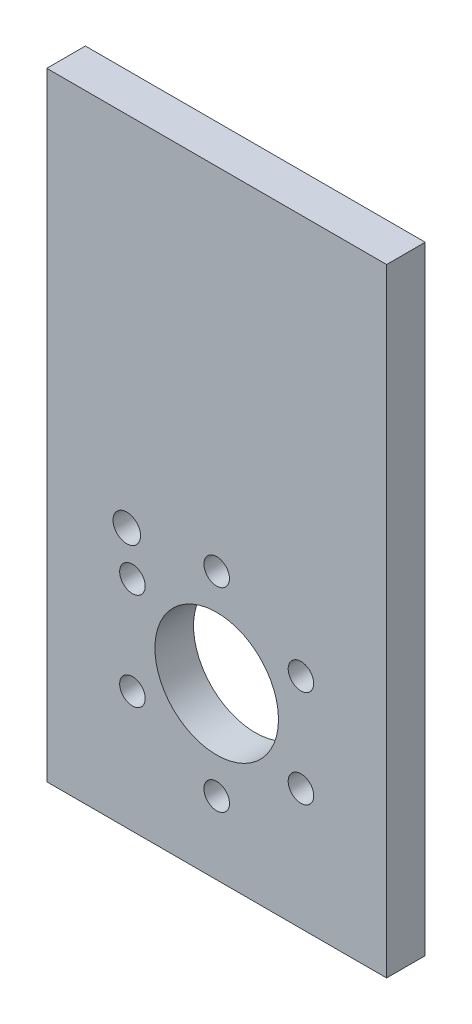
ISO-10303-21;
HEADER;
FILE_DESCRIPTION(('STEP AP214'),'2;1');
FILE_NAME('part.step','',(''),(''),'','','');
FILE_SCHEMA(('AUTOMOTIVE_DESIGN { 1 0 10303 214 1 1 1 1 }'));
ENDSEC;
DATA;
#1=APPLICATION_CONTEXT('core data for automotive mechanical design processes');
#2=APPLICATION_PROTOCOL_DEFINITION('international standard','automotive_design',2000,#1);
#3=PRODUCT_CONTEXT('',#1,'mechanical');
#4=PRODUCT('Part','Part','',(#3));
#5=PRODUCT_RELATED_PRODUCT_CATEGORY('part','',(#4));
#6=PRODUCT_DEFINITION_FORMATION('','',#4);
#7=PRODUCT_DEFINITION_CONTEXT('part definition',#1,'design');
#8=PRODUCT_DEFINITION('design','',#6,#7);
#9=PRODUCT_DEFINITION_SHAPE('','',#8);
#10=(LENGTH_UNIT() NAMED_UNIT(*) SI_UNIT(.MILLI.,.METRE.));
#11=(NAMED_UNIT(*) PLANE_ANGLE_UNIT() SI_UNIT($,.RADIAN.));
#12=(NAMED_UNIT(*) SI_UNIT($,.STERADIAN.) SOLID_ANGLE_UNIT());
#13=UNCERTAINTY_MEASURE_WITH_UNIT(LENGTH_MEASURE(1.E-05),#10,'distance_accuracy_value','');
#14=(GEOMETRIC_REPRESENTATION_CONTEXT(3) GLOBAL_UNCERTAINTY_ASSIGNED_CONTEXT((#13)) GLOBAL_UNIT_ASSIGNED_CONTEXT((#10,
#11,#12)) REPRESENTATION_CONTEXT('',''));
#15=CARTESIAN_POINT('',(0.,0.,0.));
#16=DIRECTION('',(0.,0.,1.));
#17=DIRECTION('',(1.,0.,0.));
#18=AXIS2_PLACEMENT_3D('',#15,#16,#17);
#19=CARTESIAN_POINT('',(0.,0.,3.175));
#20=DIRECTION('',(0.,0.,-1.));
#21=DIRECTION('',(-1.,0.,0.));
#22=AXIS2_PLACEMENT_3D('',#19,#20,#21);
#23=PLANE('',#22);
#24=CARTESIAN_POINT('',(-7.39143301999999,7.39597459719477,3.175));
#25=DIRECTION('',(0.,0.,1.));
#26=DIRECTION('',(1.,0.,0.));
#27=AXIS2_PLACEMENT_3D('',#24,#25,#26);
#28=CIRCLE('',#27,1.1303);
#29=CARTESIAN_POINT('',(-6.26113302,7.39597459719477,3.175));
#30=VERTEX_POINT('',#29);
#31=EDGE_CURVE('E156',#30,#30,#28,.T.);
#32=ORIENTED_EDGE('',*,*,#31,.F.);
#33=EDGE_LOOP('',(#32));
#34=FACE_BOUND('',#33,.T.);
#35=CARTESIAN_POINT('',(0.,7.99999999946,3.175));
#36=DIRECTION('',(0.,0.,1.));
#37=DIRECTION('',(1.,0.,0.));
#38=AXIS2_PLACEMENT_3D('',#35,#36,#37);
#39=CIRCLE('',#38,1.05);
#40=CARTESIAN_POINT('',(1.05,7.99999999946,3.175));
#41=VERTEX_POINT('',#40);
#42=EDGE_CURVE('E139',#41,#41,#39,.T.);
#43=ORIENTED_EDGE('',*,*,#42,.F.);
#44=EDGE_LOOP('',(#43));
#45=FACE_BOUND('',#44,.T.);
#46=CARTESIAN_POINT('',(6.92820323018,-4.000000001,3.175));
#47=DIRECTION('',(0.,0.,1.));
#48=DIRECTION('',(1.,0.,0.));
#49=AXIS2_PLACEMENT_3D('',#46,#47,#48);
#50=CIRCLE('',#49,1.05);
#51=CARTESIAN_POINT('',(7.97820323018,-4.000000001,3.175));
#52=VERTEX_POINT('',#51);
#53=EDGE_CURVE('E127',#52,#52,#50,.T.);
#54=ORIENTED_EDGE('',*,*,#53,.F.);
#55=EDGE_LOOP('',(#54));
#56=FACE_BOUND('',#55,.T.);
#57=CARTESIAN_POINT('',(-6.92820323018,-4.000000001,3.175));
#58=DIRECTION('',(0.,0.,1.));
#59=DIRECTION('',(1.,0.,0.));
#60=AXIS2_PLACEMENT_3D('',#57,#58,#59);
#61=CIRCLE('',#60,1.05);
#62=CARTESIAN_POINT('',(-5.87820323018,-4.000000001,3.175));
#63=VERTEX_POINT('',#62);
#64=EDGE_CURVE('E115',#63,#63,#61,.T.);
#65=ORIENTED_EDGE('',*,*,#64,.F.);
#66=EDGE_LOOP('',(#65));
#67=FACE_BOUND('',#66,.T.);
#68=DIRECTION('',(0.,-1.,0.));
#69=VECTOR('',#68,1.);
#70=CARTESIAN_POINT('',(-13.97,-13.97,3.175));
#71=LINE('',#70,#69);
#72=CARTESIAN_POINT('',(-13.97,36.83,3.175));
#73=VERTEX_POINT('',#72);
#74=CARTESIAN_POINT('',(-13.97,-13.97,3.175));
#75=VERTEX_POINT('',#74);
#76=EDGE_CURVE('E85',#73,#75,#71,.T.);
#77=ORIENTED_EDGE('',*,*,#76,.T.);
#78=DIRECTION('',(1.,0.,0.));
#79=VECTOR('',#78,1.);
#80=CARTESIAN_POINT('',(-13.97,-13.97,3.175));
#81=LINE('',#80,#79);
#82=CARTESIAN_POINT('',(13.97,-13.97,3.175));
#83=VERTEX_POINT('',#82);
#84=EDGE_CURVE('E80',#75,#83,#81,.T.);
#85=ORIENTED_EDGE('',*,*,#84,.T.);
#86=DIRECTION('',(0.,1.,0.));
#87=VECTOR('',#86,1.);
#88=CARTESIAN_POINT('',(13.97,-13.97,3.175));
#89=LINE('',#88,#87);
#90=CARTESIAN_POINT('',(13.97,36.83,3.175));
#91=VERTEX_POINT('',#90);
#92=EDGE_CURVE('E83',#83,#91,#89,.T.);
#93=ORIENTED_EDGE('',*,*,#92,.T.);
#94=DIRECTION('',(-1.,0.,0.));
#95=VECTOR('',#94,1.);
#96=CARTESIAN_POINT('',(-13.97,36.83,3.175));
#97=LINE('',#96,#95);
#98=EDGE_CURVE('E50',#91,#73,#97,.T.);
#99=ORIENTED_EDGE('',*,*,#98,.T.);
#100=EDGE_LOOP('',(#77,#85,#93,#99));
#101=FACE_BOUND('',#100,.T.);
#102=CARTESIAN_POINT('',(-6.92820323018,4.000000001,3.175));
#103=DIRECTION('',(0.,0.,1.));
#104=DIRECTION('',(1.,0.,0.));
#105=AXIS2_PLACEMENT_3D('',#102,#103,#104);
#106=CIRCLE('',#105,1.05);
#107=CARTESIAN_POINT('',(-5.87820323018,4.000000001,3.175));
#108=VERTEX_POINT('',#107);
#109=EDGE_CURVE('E100',#108,#108,#106,.T.);
#110=ORIENTED_EDGE('',*,*,#109,.F.);
#111=EDGE_LOOP('',(#110));
#112=FACE_BOUND('',#111,.T.);
#113=CARTESIAN_POINT('',(0.,-7.99999999946,3.175));
#114=DIRECTION('',(0.,0.,1.));
#115=DIRECTION('',(1.,0.,0.));
#116=AXIS2_PLACEMENT_3D('',#113,#114,#115);
#117=CIRCLE('',#116,1.05);
#118=CARTESIAN_POINT('',(1.05,-7.99999999946,3.175));
#119=VERTEX_POINT('',#118);
#120=EDGE_CURVE('E121',#119,#119,#117,.T.);
#121=ORIENTED_EDGE('',*,*,#120,.F.);
#122=EDGE_LOOP('',(#121));
#123=FACE_BOUND('',#122,.T.);
#124=CARTESIAN_POINT('',(6.92820323018,4.000000001,3.175));
#125=DIRECTION('',(0.,0.,1.));
#126=DIRECTION('',(1.,0.,0.));
#127=AXIS2_PLACEMENT_3D('',#124,#125,#126);
#128=CIRCLE('',#127,1.05);
#129=CARTESIAN_POINT('',(7.97820323018,4.000000001,3.175));
#130=VERTEX_POINT('',#129);
#131=EDGE_CURVE('E133',#130,#130,#128,.T.);
#132=ORIENTED_EDGE('',*,*,#131,.F.);
#133=EDGE_LOOP('',(#132));
#134=FACE_BOUND('',#133,.T.);
#135=CARTESIAN_POINT('',(0.,0.,3.175));
#136=DIRECTION('',(0.,0.,1.));
#137=DIRECTION('',(1.,0.,0.));
#138=AXIS2_PLACEMENT_3D('',#135,#136,#137);
#139=CIRCLE('',#138,5.08);
#140=CARTESIAN_POINT('',(5.08,0.,3.175));
#141=VERTEX_POINT('',#140);
#142=EDGE_CURVE('E145',#141,#141,#139,.T.);
#143=ORIENTED_EDGE('',*,*,#142,.F.);
#144=EDGE_LOOP('',(#143));
#145=FACE_BOUND('',#144,.T.);
#146=ADVANCED_FACE('F33',(#34,#45,#56,#67,#101,#112,#123,#134,#145),#23,.F.);
#147=CARTESIAN_POINT('',(0.,0.,0.));
#148=DIRECTION('',(0.,0.,-1.));
#149=DIRECTION('',(-1.,0.,0.));
#150=AXIS2_PLACEMENT_3D('',#147,#148,#149);
#151=PLANE('',#150);
#152=CARTESIAN_POINT('',(-7.39143301999999,7.39597459719477,0.));
#153=DIRECTION('',(0.,0.,-1.));
#154=DIRECTION('',(-1.,0.,0.));
#155=AXIS2_PLACEMENT_3D('',#152,#153,#154);
#156=CIRCLE('',#155,1.1303);
#157=CARTESIAN_POINT('',(-8.52173301999999,7.39597459719477,0.));
#158=VERTEX_POINT('',#157);
#159=EDGE_CURVE('E151',#158,#158,#156,.T.);
#160=ORIENTED_EDGE('',*,*,#159,.F.);
#161=EDGE_LOOP('',(#160));
#162=FACE_BOUND('',#161,.T.);
#163=CARTESIAN_POINT('',(0.,7.99999999946,0.));
#164=DIRECTION('',(0.,0.,1.));
#165=DIRECTION('',(1.,0.,0.));
#166=AXIS2_PLACEMENT_3D('',#163,#164,#165);
#167=CIRCLE('',#166,1.05);
#168=CARTESIAN_POINT('',(1.05,7.99999999946,0.));
#169=VERTEX_POINT('',#168);
#170=EDGE_CURVE('E142',#169,#169,#167,.T.);
#171=ORIENTED_EDGE('',*,*,#170,.T.);
#172=EDGE_LOOP('',(#171));
#173=FACE_BOUND('',#172,.T.);
#174=CARTESIAN_POINT('',(6.92820323018,-4.000000001,0.));
#175=DIRECTION('',(0.,0.,1.));
#176=DIRECTION('',(1.,0.,0.));
#177=AXIS2_PLACEMENT_3D('',#174,#175,#176);
#178=CIRCLE('',#177,1.05);
#179=CARTESIAN_POINT('',(7.97820323018,-4.000000001,0.));
#180=VERTEX_POINT('',#179);
#181=EDGE_CURVE('E130',#180,#180,#178,.T.);
#182=ORIENTED_EDGE('',*,*,#181,.T.);
#183=EDGE_LOOP('',(#182));
#184=FACE_BOUND('',#183,.T.);
#185=CARTESIAN_POINT('',(-6.92820323018,-4.000000001,0.));
#186=DIRECTION('',(0.,0.,1.));
#187=DIRECTION('',(1.,0.,0.));
#188=AXIS2_PLACEMENT_3D('',#185,#186,#187);
#189=CIRCLE('',#188,1.05);
#190=CARTESIAN_POINT('',(-5.87820323018,-4.000000001,0.));
#191=VERTEX_POINT('',#190);
#192=EDGE_CURVE('E118',#191,#191,#189,.T.);
#193=ORIENTED_EDGE('',*,*,#192,.T.);
#194=EDGE_LOOP('',(#193));
#195=FACE_BOUND('',#194,.T.);
#196=DIRECTION('',(0.,-1.,0.));
#197=VECTOR('',#196,1.);
#198=CARTESIAN_POINT('',(-13.97,-13.97,0.));
#199=LINE('',#198,#197);
#200=CARTESIAN_POINT('',(-13.97,36.83,0.));
#201=VERTEX_POINT('',#200);
#202=CARTESIAN_POINT('',(-13.97,-13.97,0.));
#203=VERTEX_POINT('',#202);
#204=EDGE_CURVE('E97',#201,#203,#199,.T.);
#205=ORIENTED_EDGE('',*,*,#204,.F.);
#206=DIRECTION('',(-1.,0.,0.));
#207=VECTOR('',#206,1.);
#208=CARTESIAN_POINT('',(-13.97,36.83,0.));
#209=LINE('',#208,#207);
#210=CARTESIAN_POINT('',(13.97,36.83,0.));
#211=VERTEX_POINT('',#210);
#212=EDGE_CURVE('E73',#211,#201,#209,.T.);
#213=ORIENTED_EDGE('',*,*,#212,.F.);
#214=DIRECTION('',(0.,1.,0.));
#215=VECTOR('',#214,1.);
#216=CARTESIAN_POINT('',(13.97,-13.97,0.));
#217=LINE('',#216,#215);
#218=CARTESIAN_POINT('',(13.97,-13.97,0.));
#219=VERTEX_POINT('',#218);
#220=EDGE_CURVE('E67',#219,#211,#217,.T.);
#221=ORIENTED_EDGE('',*,*,#220,.F.);
#222=DIRECTION('',(1.,0.,0.));
#223=VECTOR('',#222,1.);
#224=CARTESIAN_POINT('',(-13.97,-13.97,0.));
#225=LINE('',#224,#223);
#226=EDGE_CURVE('E89',#203,#219,#225,.T.);
#227=ORIENTED_EDGE('',*,*,#226,.F.);
#228=EDGE_LOOP('',(#205,#213,#221,#227));
#229=FACE_BOUND('',#228,.T.);
#230=CARTESIAN_POINT('',(-6.92820323018,4.000000001,0.));
#231=DIRECTION('',(0.,0.,1.));
#232=DIRECTION('',(1.,0.,0.));
#233=AXIS2_PLACEMENT_3D('',#230,#231,#232);
#234=CIRCLE('',#233,1.05);
#235=CARTESIAN_POINT('',(-5.87820323018,4.000000001,0.));
#236=VERTEX_POINT('',#235);
#237=EDGE_CURVE('E112',#236,#236,#234,.T.);
#238=ORIENTED_EDGE('',*,*,#237,.T.);
#239=EDGE_LOOP('',(#238));
#240=FACE_BOUND('',#239,.T.);
#241=CARTESIAN_POINT('',(0.,-7.99999999946,0.));
#242=DIRECTION('',(0.,0.,1.));
#243=DIRECTION('',(1.,0.,0.));
#244=AXIS2_PLACEMENT_3D('',#241,#242,#243);
#245=CIRCLE('',#244,1.05);
#246=CARTESIAN_POINT('',(1.05,-7.99999999946,0.));
#247=VERTEX_POINT('',#246);
#248=EDGE_CURVE('E124',#247,#247,#245,.T.);
#249=ORIENTED_EDGE('',*,*,#248,.T.);
#250=EDGE_LOOP('',(#249));
#251=FACE_BOUND('',#250,.T.);
#252=CARTESIAN_POINT('',(6.92820323018,4.000000001,0.));
#253=DIRECTION('',(0.,0.,1.));
#254=DIRECTION('',(1.,0.,0.));
#255=AXIS2_PLACEMENT_3D('',#252,#253,#254);
#256=CIRCLE('',#255,1.05);
#257=CARTESIAN_POINT('',(7.97820323018,4.000000001,0.));
#258=VERTEX_POINT('',#257);
#259=EDGE_CURVE('E136',#258,#258,#256,.T.);
#260=ORIENTED_EDGE('',*,*,#259,.T.);
#261=EDGE_LOOP('',(#260));
#262=FACE_BOUND('',#261,.T.);
#263=CARTESIAN_POINT('',(0.,0.,0.));
#264=DIRECTION('',(0.,0.,1.));
#265=DIRECTION('',(1.,0.,0.));
#266=AXIS2_PLACEMENT_3D('',#263,#264,#265);
#267=CIRCLE('',#266,5.08);
#268=CARTESIAN_POINT('',(5.08,0.,0.));
#269=VERTEX_POINT('',#268);
#270=EDGE_CURVE('E148',#269,#269,#267,.T.);
#271=ORIENTED_EDGE('',*,*,#270,.T.);
#272=EDGE_LOOP('',(#271));
#273=FACE_BOUND('',#272,.T.);
#274=ADVANCED_FACE('F108',(#162,#173,#184,#195,#229,#240,#251,#262,#273),#151,.T.);
#275=CARTESIAN_POINT('',(-13.97,-13.97,3.175));
#276=DIRECTION('',(1.,0.,0.));
#277=DIRECTION('',(0.,1.,0.));
#278=AXIS2_PLACEMENT_3D('',#275,#276,#277);
#279=PLANE('',#278);
#280=ORIENTED_EDGE('',*,*,#204,.T.);
#281=DIRECTION('',(0.,0.,-1.));
#282=VECTOR('',#281,1.);
#283=CARTESIAN_POINT('',(-13.97,-13.97,3.175));
#284=LINE('',#283,#282);
#285=EDGE_CURVE('E11',#75,#203,#284,.T.);
#286=ORIENTED_EDGE('',*,*,#285,.F.);
#287=ORIENTED_EDGE('',*,*,#76,.F.);
#288=DIRECTION('',(0.,0.,-1.));
#289=VECTOR('',#288,1.);
#290=CARTESIAN_POINT('',(-13.97,36.83,3.175));
#291=LINE('',#290,#289);
#292=EDGE_CURVE('E93',#73,#201,#291,.T.);
#293=ORIENTED_EDGE('',*,*,#292,.T.);
#294=EDGE_LOOP('',(#280,#286,#287,#293));
#295=FACE_BOUND('',#294,.T.);
#296=ADVANCED_FACE('F35',(#295),#279,.F.);
#297=CARTESIAN_POINT('',(-13.97,-13.97,3.175));
#298=DIRECTION('',(0.,1.,0.));
#299=DIRECTION('',(0.,0.,1.));
#300=AXIS2_PLACEMENT_3D('',#297,#298,#299);
#301=PLANE('',#300);
#302=ORIENTED_EDGE('',*,*,#226,.T.);
#303=DIRECTION('',(0.,0.,-1.));
#304=VECTOR('',#303,1.);
#305=CARTESIAN_POINT('',(13.97,-13.97,3.175));
#306=LINE('',#305,#304);
#307=EDGE_CURVE('E42',#83,#219,#306,.T.);
#308=ORIENTED_EDGE('',*,*,#307,.F.);
#309=ORIENTED_EDGE('',*,*,#84,.F.);
#310=ORIENTED_EDGE('',*,*,#285,.T.);
#311=EDGE_LOOP('',(#302,#308,#309,#310));
#312=FACE_BOUND('',#311,.T.);
#313=ADVANCED_FACE('F88',(#312),#301,.F.);
#314=CARTESIAN_POINT('',(13.97,-13.97,3.175));
#315=DIRECTION('',(-1.,0.,0.));
#316=DIRECTION('',(0.,0.,1.));
#317=AXIS2_PLACEMENT_3D('',#314,#315,#316);
#318=PLANE('',#317);
#319=ORIENTED_EDGE('',*,*,#220,.T.);
#320=DIRECTION('',(0.,0.,-1.));
#321=VECTOR('',#320,1.);
#322=CARTESIAN_POINT('',(13.97,36.83,3.175));
#323=LINE('',#322,#321);
#324=EDGE_CURVE('E90',#91,#211,#323,.T.);
#325=ORIENTED_EDGE('',*,*,#324,.F.);
#326=ORIENTED_EDGE('',*,*,#92,.F.);
#327=ORIENTED_EDGE('',*,*,#307,.T.);
#328=EDGE_LOOP('',(#319,#325,#326,#327));
#329=FACE_BOUND('',#328,.T.);
#330=ADVANCED_FACE('F91',(#329),#318,.F.);
#331=CARTESIAN_POINT('',(-13.97,36.83,3.175));
#332=DIRECTION('',(0.,-1.,0.));
#333=DIRECTION('',(0.,0.,-1.));
#334=AXIS2_PLACEMENT_3D('',#331,#332,#333);
#335=PLANE('',#334);
#336=ORIENTED_EDGE('',*,*,#212,.T.);
#337=ORIENTED_EDGE('',*,*,#292,.F.);
#338=ORIENTED_EDGE('',*,*,#98,.F.);
#339=ORIENTED_EDGE('',*,*,#324,.T.);
#340=EDGE_LOOP('',(#336,#337,#338,#339));
#341=FACE_BOUND('',#340,.T.);
#342=ADVANCED_FACE('F105',(#341),#335,.F.);
#343=CARTESIAN_POINT('',(-6.92820323018,4.000000001,3.175));
#344=DIRECTION('',(0.,0.,-1.));
#345=DIRECTION('',(-1.,0.,0.));
#346=AXIS2_PLACEMENT_3D('',#343,#344,#345);
#347=CYLINDRICAL_SURFACE('',#346,1.05);
#348=ORIENTED_EDGE('',*,*,#109,.T.);
#349=EDGE_LOOP('',(#348));
#350=FACE_BOUND('',#349,.T.);
#351=ORIENTED_EDGE('',*,*,#237,.F.);
#352=EDGE_LOOP('',(#351));
#353=FACE_BOUND('',#352,.T.);
#354=ADVANCED_FACE('F175',(#350,#353),#347,.F.);
#355=CARTESIAN_POINT('',(-6.92820323018,-4.000000001,3.175));
#356=DIRECTION('',(0.,0.,-1.));
#357=DIRECTION('',(-1.,0.,0.));
#358=AXIS2_PLACEMENT_3D('',#355,#356,#357);
#359=CYLINDRICAL_SURFACE('',#358,1.05);
#360=ORIENTED_EDGE('',*,*,#64,.T.);
#361=EDGE_LOOP('',(#360));
#362=FACE_BOUND('',#361,.T.);
#363=ORIENTED_EDGE('',*,*,#192,.F.);
#364=EDGE_LOOP('',(#363));
#365=FACE_BOUND('',#364,.T.);
#366=ADVANCED_FACE('F171',(#362,#365),#359,.F.);
#367=CARTESIAN_POINT('',(0.,-7.99999999946,3.175));
#368=DIRECTION('',(0.,0.,-1.));
#369=DIRECTION('',(-1.,0.,0.));
#370=AXIS2_PLACEMENT_3D('',#367,#368,#369);
#371=CYLINDRICAL_SURFACE('',#370,1.05);
#372=ORIENTED_EDGE('',*,*,#120,.T.);
#373=EDGE_LOOP('',(#372));
#374=FACE_BOUND('',#373,.T.);
#375=ORIENTED_EDGE('',*,*,#248,.F.);
#376=EDGE_LOOP('',(#375));
#377=FACE_BOUND('',#376,.T.);
#378=ADVANCED_FACE('F174',(#374,#377),#371,.F.);
#379=CARTESIAN_POINT('',(6.92820323018,-4.000000001,3.175));
#380=DIRECTION('',(0.,0.,-1.));
#381=DIRECTION('',(-1.,0.,0.));
#382=AXIS2_PLACEMENT_3D('',#379,#380,#381);
#383=CYLINDRICAL_SURFACE('',#382,1.05);
#384=ORIENTED_EDGE('',*,*,#53,.T.);
#385=EDGE_LOOP('',(#384));
#386=FACE_BOUND('',#385,.T.);
#387=ORIENTED_EDGE('',*,*,#181,.F.);
#388=EDGE_LOOP('',(#387));
#389=FACE_BOUND('',#388,.T.);
#390=ADVANCED_FACE('F221',(#386,#389),#383,.F.);
#391=CARTESIAN_POINT('',(6.92820323018,4.000000001,3.175));
#392=DIRECTION('',(0.,0.,-1.));
#393=DIRECTION('',(-1.,0.,0.));
#394=AXIS2_PLACEMENT_3D('',#391,#392,#393);
#395=CYLINDRICAL_SURFACE('',#394,1.05);
#396=ORIENTED_EDGE('',*,*,#131,.T.);
#397=EDGE_LOOP('',(#396));
#398=FACE_BOUND('',#397,.T.);
#399=ORIENTED_EDGE('',*,*,#259,.F.);
#400=EDGE_LOOP('',(#399));
#401=FACE_BOUND('',#400,.T.);
#402=ADVANCED_FACE('F229',(#398,#401),#395,.F.);
#403=CARTESIAN_POINT('',(0.,7.99999999946,3.175));
#404=DIRECTION('',(0.,0.,-1.));
#405=DIRECTION('',(-1.,0.,0.));
#406=AXIS2_PLACEMENT_3D('',#403,#404,#405);
#407=CYLINDRICAL_SURFACE('',#406,1.05);
#408=ORIENTED_EDGE('',*,*,#42,.T.);
#409=EDGE_LOOP('',(#408));
#410=FACE_BOUND('',#409,.T.);
#411=ORIENTED_EDGE('',*,*,#170,.F.);
#412=EDGE_LOOP('',(#411));
#413=FACE_BOUND('',#412,.T.);
#414=ADVANCED_FACE('F237',(#410,#413),#407,.F.);
#415=CARTESIAN_POINT('',(0.,0.,3.175));
#416=DIRECTION('',(0.,0.,-1.));
#417=DIRECTION('',(-1.,0.,0.));
#418=AXIS2_PLACEMENT_3D('',#415,#416,#417);
#419=CYLINDRICAL_SURFACE('',#418,5.08);
#420=ORIENTED_EDGE('',*,*,#142,.T.);
#421=EDGE_LOOP('',(#420));
#422=FACE_BOUND('',#421,.T.);
#423=ORIENTED_EDGE('',*,*,#270,.F.);
#424=EDGE_LOOP('',(#423));
#425=FACE_BOUND('',#424,.T.);
#426=ADVANCED_FACE('F245',(#422,#425),#419,.F.);
#427=CARTESIAN_POINT('',(-7.39143301999999,7.39597459719477,3.175));
#428=DIRECTION('',(0.,0.,1.));
#429=DIRECTION('',(1.,0.,0.));
#430=AXIS2_PLACEMENT_3D('',#427,#428,#429);
#431=CYLINDRICAL_SURFACE('',#430,1.1303);
#432=ORIENTED_EDGE('',*,*,#159,.T.);
#433=EDGE_LOOP('',(#432));
#434=FACE_BOUND('',#433,.T.);
#435=ORIENTED_EDGE('',*,*,#31,.T.);
#436=EDGE_LOOP('',(#435));
#437=FACE_BOUND('',#436,.T.);
#438=ADVANCED_FACE('F160',(#434,#437),#431,.F.);
#439=CLOSED_SHELL('',(#146,#274,#296,#313,#330,#342,#354,#366,#378,#390,#402,#414,#426,#438));
#440=MANIFOLD_SOLID_BREP('B2',#439);
#441=ADVANCED_BREP_SHAPE_REPRESENTATION('',(#18,#440),#14);
#442=SHAPE_DEFINITION_REPRESENTATION(#9,#441);
ENDSEC;
END-ISO-10303-21;
